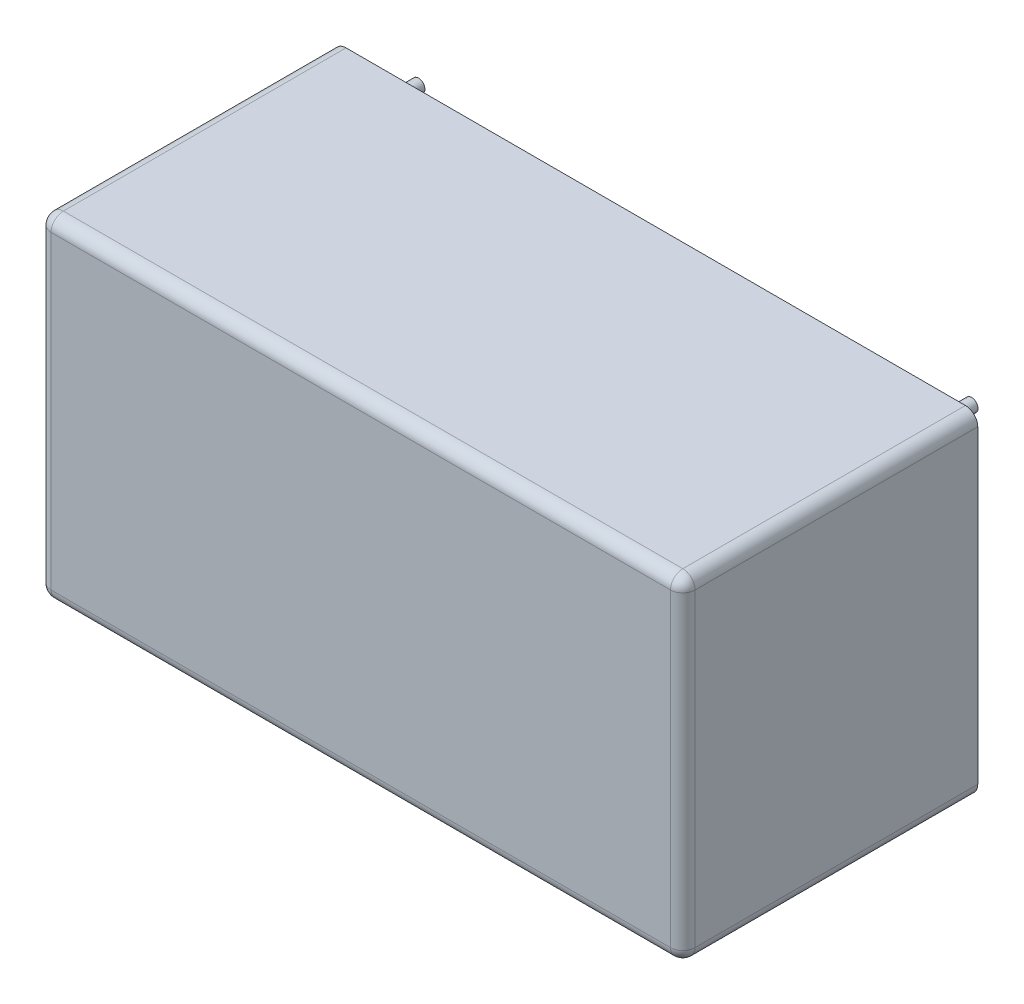
ISO-10303-21;
HEADER;
FILE_DESCRIPTION(('STEP AP214'),'2;1');
FILE_NAME('part.step','',(''),(''),'','','');
FILE_SCHEMA(('AUTOMOTIVE_DESIGN { 1 0 10303 214 1 1 1 1 }'));
ENDSEC;
DATA;
#1=APPLICATION_CONTEXT('core data for automotive mechanical design processes');
#2=APPLICATION_PROTOCOL_DEFINITION('international standard','automotive_design',2000,#1);
#3=PRODUCT_CONTEXT('',#1,'mechanical');
#4=PRODUCT('Part','Part','',(#3));
#5=PRODUCT_RELATED_PRODUCT_CATEGORY('part','',(#4));
#6=PRODUCT_DEFINITION_FORMATION('','',#4);
#7=PRODUCT_DEFINITION_CONTEXT('part definition',#1,'design');
#8=PRODUCT_DEFINITION('design','',#6,#7);
#9=PRODUCT_DEFINITION_SHAPE('','',#8);
#10=(LENGTH_UNIT() NAMED_UNIT(*) SI_UNIT(.MILLI.,.METRE.));
#11=(NAMED_UNIT(*) PLANE_ANGLE_UNIT() SI_UNIT($,.RADIAN.));
#12=(NAMED_UNIT(*) SI_UNIT($,.STERADIAN.) SOLID_ANGLE_UNIT());
#13=UNCERTAINTY_MEASURE_WITH_UNIT(LENGTH_MEASURE(1.E-05),#10,'distance_accuracy_value','');
#14=(GEOMETRIC_REPRESENTATION_CONTEXT(3) GLOBAL_UNCERTAINTY_ASSIGNED_CONTEXT((#13)) GLOBAL_UNIT_ASSIGNED_CONTEXT((#10,
#11,#12)) REPRESENTATION_CONTEXT('',''));
#15=CARTESIAN_POINT('',(0.,0.,0.));
#16=DIRECTION('',(0.,0.,1.));
#17=DIRECTION('',(1.,0.,0.));
#18=AXIS2_PLACEMENT_3D('',#15,#16,#17);
#19=CARTESIAN_POINT('',(-25.2,12.6,24.));
#20=DIRECTION('',(0.,0.,-1.));
#21=DIRECTION('',(-1.,0.,0.));
#22=AXIS2_PLACEMENT_3D('',#19,#20,#21);
#23=CYLINDRICAL_SURFACE('',#22,1.);
#24=DIRECTION('',(0.,0.,-1.));
#25=VECTOR('',#24,1.);
#26=CARTESIAN_POINT('',(-26.2,12.6,24.));
#27=LINE('',#26,#25);
#28=CARTESIAN_POINT('',(-26.2,12.6,23.));
#29=VERTEX_POINT('',#28);
#30=CARTESIAN_POINT('',(-26.2,12.6,0.));
#31=VERTEX_POINT('',#30);
#32=EDGE_CURVE('E109',#29,#31,#27,.T.);
#33=ORIENTED_EDGE('',*,*,#32,.F.);
#34=CARTESIAN_POINT('',(-25.2,12.6,23.));
#35=DIRECTION('',(0.,0.,-1.));
#36=DIRECTION('',(-1.,0.,0.));
#37=AXIS2_PLACEMENT_3D('',#34,#35,#36);
#38=CIRCLE('',#37,1.);
#39=CARTESIAN_POINT('',(-25.2,13.6,23.));
#40=VERTEX_POINT('',#39);
#41=EDGE_CURVE('E11',#29,#40,#38,.T.);
#42=ORIENTED_EDGE('',*,*,#41,.T.);
#43=DIRECTION('',(0.,0.,-1.));
#44=VECTOR('',#43,1.);
#45=CARTESIAN_POINT('',(-25.2,13.6,24.));
#46=LINE('',#45,#44);
#47=CARTESIAN_POINT('',(-25.2,13.6,0.));
#48=VERTEX_POINT('',#47);
#49=EDGE_CURVE('E131',#40,#48,#46,.T.);
#50=ORIENTED_EDGE('',*,*,#49,.T.);
#51=CARTESIAN_POINT('',(-25.2,12.6,0.));
#52=DIRECTION('',(0.,0.,1.));
#53=DIRECTION('',(1.,0.,0.));
#54=AXIS2_PLACEMENT_3D('',#51,#52,#53);
#55=CIRCLE('',#54,1.);
#56=EDGE_CURVE('E124',#48,#31,#55,.T.);
#57=ORIENTED_EDGE('',*,*,#56,.T.);
#58=EDGE_LOOP('',(#33,#42,#50,#57));
#59=FACE_BOUND('',#58,.T.);
#60=ADVANCED_FACE('F33',(#59),#23,.T.);
#61=CARTESIAN_POINT('',(-26.2,12.6,24.));
#62=DIRECTION('',(1.,0.,0.));
#63=DIRECTION('',(0.,1.,0.));
#64=AXIS2_PLACEMENT_3D('',#61,#62,#63);
#65=PLANE('',#64);
#66=DIRECTION('',(0.,0.,-1.));
#67=VECTOR('',#66,1.);
#68=CARTESIAN_POINT('',(-26.2,-12.6,24.));
#69=LINE('',#68,#67);
#70=CARTESIAN_POINT('',(-26.2,-12.6,23.));
#71=VERTEX_POINT('',#70);
#72=CARTESIAN_POINT('',(-26.2,-12.6,0.));
#73=VERTEX_POINT('',#72);
#74=EDGE_CURVE('E118',#71,#73,#69,.T.);
#75=ORIENTED_EDGE('',*,*,#74,.F.);
#76=DIRECTION('',(0.,-1.,0.));
#77=VECTOR('',#76,1.);
#78=CARTESIAN_POINT('',(-26.2,12.6,23.));
#79=LINE('',#78,#77);
#80=EDGE_CURVE('E42',#71,#29,#79,.F.);
#81=ORIENTED_EDGE('',*,*,#80,.T.);
#82=ORIENTED_EDGE('',*,*,#32,.T.);
#83=DIRECTION('',(0.,-1.,0.));
#84=VECTOR('',#83,1.);
#85=CARTESIAN_POINT('',(-26.2,12.6,0.));
#86=LINE('',#85,#84);
#87=EDGE_CURVE('E112',#31,#73,#86,.T.);
#88=ORIENTED_EDGE('',*,*,#87,.T.);
#89=EDGE_LOOP('',(#75,#81,#82,#88));
#90=FACE_BOUND('',#89,.T.);
#91=ADVANCED_FACE('F111',(#90),#65,.F.);
#92=CARTESIAN_POINT('',(-25.2,-12.6,24.));
#93=DIRECTION('',(0.,0.,-1.));
#94=DIRECTION('',(-1.,0.,0.));
#95=AXIS2_PLACEMENT_3D('',#92,#93,#94);
#96=CYLINDRICAL_SURFACE('',#95,1.);
#97=DIRECTION('',(0.,0.,-1.));
#98=VECTOR('',#97,1.);
#99=CARTESIAN_POINT('',(-25.2,-13.6,24.));
#100=LINE('',#99,#98);
#101=CARTESIAN_POINT('',(-25.2,-13.6,23.));
#102=VERTEX_POINT('',#101);
#103=CARTESIAN_POINT('',(-25.2,-13.6,0.));
#104=VERTEX_POINT('',#103);
#105=EDGE_CURVE('E163',#102,#104,#100,.T.);
#106=ORIENTED_EDGE('',*,*,#105,.F.);
#107=CARTESIAN_POINT('',(-25.2,-12.6,23.));
#108=DIRECTION('',(0.,0.,-1.));
#109=DIRECTION('',(-1.,0.,0.));
#110=AXIS2_PLACEMENT_3D('',#107,#108,#109);
#111=CIRCLE('',#110,1.);
#112=EDGE_CURVE('E57',#102,#71,#111,.T.);
#113=ORIENTED_EDGE('',*,*,#112,.T.);
#114=ORIENTED_EDGE('',*,*,#74,.T.);
#115=CARTESIAN_POINT('',(-25.2,-12.6,0.));
#116=DIRECTION('',(0.,0.,1.));
#117=DIRECTION('',(1.,0.,0.));
#118=AXIS2_PLACEMENT_3D('',#115,#116,#117);
#119=CIRCLE('',#118,1.);
#120=EDGE_CURVE('E128',#73,#104,#119,.T.);
#121=ORIENTED_EDGE('',*,*,#120,.T.);
#122=EDGE_LOOP('',(#106,#113,#114,#121));
#123=FACE_BOUND('',#122,.T.);
#124=ADVANCED_FACE('F217',(#123),#96,.T.);
#125=CARTESIAN_POINT('',(-25.2,-13.6,24.));
#126=DIRECTION('',(0.,1.,0.));
#127=DIRECTION('',(0.,0.,1.));
#128=AXIS2_PLACEMENT_3D('',#125,#126,#127);
#129=PLANE('',#128);
#130=DIRECTION('',(0.,0.,-1.));
#131=VECTOR('',#130,1.);
#132=CARTESIAN_POINT('',(25.2,-13.6,24.));
#133=LINE('',#132,#131);
#134=CARTESIAN_POINT('',(25.2,-13.6,23.));
#135=VERTEX_POINT('',#134);
#136=CARTESIAN_POINT('',(25.2,-13.6,0.));
#137=VERTEX_POINT('',#136);
#138=EDGE_CURVE('E161',#135,#137,#133,.T.);
#139=ORIENTED_EDGE('',*,*,#138,.F.);
#140=DIRECTION('',(1.,0.,0.));
#141=VECTOR('',#140,1.);
#142=CARTESIAN_POINT('',(-25.2,-13.6,23.));
#143=LINE('',#142,#141);
#144=EDGE_CURVE('E183',#135,#102,#143,.F.);
#145=ORIENTED_EDGE('',*,*,#144,.T.);
#146=ORIENTED_EDGE('',*,*,#105,.T.);
#147=DIRECTION('',(1.,0.,0.));
#148=VECTOR('',#147,1.);
#149=CARTESIAN_POINT('',(-25.2,-13.6,0.));
#150=LINE('',#149,#148);
#151=EDGE_CURVE('E140',#104,#137,#150,.T.);
#152=ORIENTED_EDGE('',*,*,#151,.T.);
#153=EDGE_LOOP('',(#139,#145,#146,#152));
#154=FACE_BOUND('',#153,.T.);
#155=ADVANCED_FACE('F216',(#154),#129,.F.);
#156=CARTESIAN_POINT('',(25.2,-12.6,24.));
#157=DIRECTION('',(0.,0.,-1.));
#158=DIRECTION('',(-1.,0.,0.));
#159=AXIS2_PLACEMENT_3D('',#156,#157,#158);
#160=CYLINDRICAL_SURFACE('',#159,1.);
#161=DIRECTION('',(0.,0.,-1.));
#162=VECTOR('',#161,1.);
#163=CARTESIAN_POINT('',(26.2,-12.6,24.));
#164=LINE('',#163,#162);
#165=CARTESIAN_POINT('',(26.2,-12.6,23.));
#166=VERTEX_POINT('',#165);
#167=CARTESIAN_POINT('',(26.2,-12.6,0.));
#168=VERTEX_POINT('',#167);
#169=EDGE_CURVE('E159',#166,#168,#164,.T.);
#170=ORIENTED_EDGE('',*,*,#169,.F.);
#171=CARTESIAN_POINT('',(25.2,-12.6,23.));
#172=DIRECTION('',(0.,0.,-1.));
#173=DIRECTION('',(-1.,0.,0.));
#174=AXIS2_PLACEMENT_3D('',#171,#172,#173);
#175=CIRCLE('',#174,1.);
#176=EDGE_CURVE('E181',#166,#135,#175,.T.);
#177=ORIENTED_EDGE('',*,*,#176,.T.);
#178=ORIENTED_EDGE('',*,*,#138,.T.);
#179=CARTESIAN_POINT('',(25.2,-12.6,0.));
#180=DIRECTION('',(0.,0.,1.));
#181=DIRECTION('',(1.,0.,0.));
#182=AXIS2_PLACEMENT_3D('',#179,#180,#181);
#183=CIRCLE('',#182,1.);
#184=EDGE_CURVE('E143',#137,#168,#183,.T.);
#185=ORIENTED_EDGE('',*,*,#184,.T.);
#186=EDGE_LOOP('',(#170,#177,#178,#185));
#187=FACE_BOUND('',#186,.T.);
#188=ADVANCED_FACE('F222',(#187),#160,.T.);
#189=CARTESIAN_POINT('',(26.2,12.6,24.));
#190=DIRECTION('',(1.,0.,0.));
#191=DIRECTION('',(0.,1.,0.));
#192=AXIS2_PLACEMENT_3D('',#189,#190,#191);
#193=PLANE('',#192);
#194=DIRECTION('',(0.,0.,-1.));
#195=VECTOR('',#194,1.);
#196=CARTESIAN_POINT('',(26.2,12.6,24.));
#197=LINE('',#196,#195);
#198=CARTESIAN_POINT('',(26.2,12.6,23.));
#199=VERTEX_POINT('',#198);
#200=CARTESIAN_POINT('',(26.2,12.6,0.));
#201=VERTEX_POINT('',#200);
#202=EDGE_CURVE('E157',#199,#201,#197,.T.);
#203=ORIENTED_EDGE('',*,*,#202,.F.);
#204=DIRECTION('',(0.,-1.,0.));
#205=VECTOR('',#204,1.);
#206=CARTESIAN_POINT('',(26.2,12.6,23.));
#207=LINE('',#206,#205);
#208=EDGE_CURVE('E179',#199,#166,#207,.T.);
#209=ORIENTED_EDGE('',*,*,#208,.T.);
#210=ORIENTED_EDGE('',*,*,#169,.T.);
#211=DIRECTION('',(0.,-1.,0.));
#212=VECTOR('',#211,1.);
#213=CARTESIAN_POINT('',(26.2,12.6,0.));
#214=LINE('',#213,#212);
#215=EDGE_CURVE('E146',#201,#168,#214,.T.);
#216=ORIENTED_EDGE('',*,*,#215,.F.);
#217=EDGE_LOOP('',(#203,#209,#210,#216));
#218=FACE_BOUND('',#217,.T.);
#219=ADVANCED_FACE('F225',(#218),#193,.T.);
#220=CARTESIAN_POINT('',(25.2,12.6,24.));
#221=DIRECTION('',(0.,0.,-1.));
#222=DIRECTION('',(-1.,0.,0.));
#223=AXIS2_PLACEMENT_3D('',#220,#221,#222);
#224=CYLINDRICAL_SURFACE('',#223,1.);
#225=DIRECTION('',(0.,0.,-1.));
#226=VECTOR('',#225,1.);
#227=CARTESIAN_POINT('',(25.2,13.6,24.));
#228=LINE('',#227,#226);
#229=CARTESIAN_POINT('',(25.2,13.6,23.));
#230=VERTEX_POINT('',#229);
#231=CARTESIAN_POINT('',(25.2,13.6,0.));
#232=VERTEX_POINT('',#231);
#233=EDGE_CURVE('E155',#230,#232,#228,.T.);
#234=ORIENTED_EDGE('',*,*,#233,.F.);
#235=CARTESIAN_POINT('',(25.2,12.6,23.));
#236=DIRECTION('',(0.,0.,-1.));
#237=DIRECTION('',(-1.,0.,0.));
#238=AXIS2_PLACEMENT_3D('',#235,#236,#237);
#239=CIRCLE('',#238,1.);
#240=EDGE_CURVE('E177',#230,#199,#239,.T.);
#241=ORIENTED_EDGE('',*,*,#240,.T.);
#242=ORIENTED_EDGE('',*,*,#202,.T.);
#243=CARTESIAN_POINT('',(25.2,12.6,0.));
#244=DIRECTION('',(0.,0.,-1.));
#245=DIRECTION('',(-1.,0.,0.));
#246=AXIS2_PLACEMENT_3D('',#243,#244,#245);
#247=CIRCLE('',#246,1.);
#248=EDGE_CURVE('E149',#232,#201,#247,.T.);
#249=ORIENTED_EDGE('',*,*,#248,.F.);
#250=EDGE_LOOP('',(#234,#241,#242,#249));
#251=FACE_BOUND('',#250,.T.);
#252=ADVANCED_FACE('F420',(#251),#224,.T.);
#253=CARTESIAN_POINT('',(-25.2,13.6,24.));
#254=DIRECTION('',(0.,1.,0.));
#255=DIRECTION('',(0.,0.,1.));
#256=AXIS2_PLACEMENT_3D('',#253,#254,#255);
#257=PLANE('',#256);
#258=ORIENTED_EDGE('',*,*,#49,.F.);
#259=DIRECTION('',(1.,0.,0.));
#260=VECTOR('',#259,1.);
#261=CARTESIAN_POINT('',(-25.2,13.6,23.));
#262=LINE('',#261,#260);
#263=EDGE_CURVE('E117',#40,#230,#262,.T.);
#264=ORIENTED_EDGE('',*,*,#263,.T.);
#265=ORIENTED_EDGE('',*,*,#233,.T.);
#266=DIRECTION('',(1.,0.,0.));
#267=VECTOR('',#266,1.);
#268=CARTESIAN_POINT('',(-25.2,13.6,0.));
#269=LINE('',#268,#267);
#270=EDGE_CURVE('E152',#48,#232,#269,.T.);
#271=ORIENTED_EDGE('',*,*,#270,.F.);
#272=EDGE_LOOP('',(#258,#264,#265,#271));
#273=FACE_BOUND('',#272,.T.);
#274=ADVANCED_FACE('F412',(#273),#257,.T.);
#275=CARTESIAN_POINT('',(-25.2,12.6,24.));
#276=DIRECTION('',(0.,0.,1.));
#277=DIRECTION('',(1.,0.,0.));
#278=AXIS2_PLACEMENT_3D('',#275,#276,#277);
#279=PLANE('',#278);
#280=DIRECTION('',(0.,-1.,0.));
#281=VECTOR('',#280,1.);
#282=CARTESIAN_POINT('',(25.2,12.6,24.));
#283=LINE('',#282,#281);
#284=CARTESIAN_POINT('',(25.2,-12.6,24.));
#285=VERTEX_POINT('',#284);
#286=CARTESIAN_POINT('',(25.2,12.6,24.));
#287=VERTEX_POINT('',#286);
#288=EDGE_CURVE('E172',#285,#287,#283,.F.);
#289=ORIENTED_EDGE('',*,*,#288,.T.);
#290=DIRECTION('',(1.,0.,0.));
#291=VECTOR('',#290,1.);
#292=CARTESIAN_POINT('',(-25.2,12.6,24.));
#293=LINE('',#292,#291);
#294=CARTESIAN_POINT('',(-25.2,12.6,24.));
#295=VERTEX_POINT('',#294);
#296=EDGE_CURVE('E174',#287,#295,#293,.F.);
#297=ORIENTED_EDGE('',*,*,#296,.T.);
#298=DIRECTION('',(0.,-1.,0.));
#299=VECTOR('',#298,1.);
#300=CARTESIAN_POINT('',(-25.2,-12.6,24.));
#301=LINE('',#300,#299);
#302=CARTESIAN_POINT('',(-25.2,-12.6,24.));
#303=VERTEX_POINT('',#302);
#304=EDGE_CURVE('E168',#295,#303,#301,.T.);
#305=ORIENTED_EDGE('',*,*,#304,.T.);
#306=DIRECTION('',(1.,0.,0.));
#307=VECTOR('',#306,1.);
#308=CARTESIAN_POINT('',(25.2,-12.6,24.));
#309=LINE('',#308,#307);
#310=EDGE_CURVE('E170',#303,#285,#309,.T.);
#311=ORIENTED_EDGE('',*,*,#310,.T.);
#312=EDGE_LOOP('',(#289,#297,#305,#311));
#313=FACE_BOUND('',#312,.T.);
#314=ADVANCED_FACE('F240',(#313),#279,.T.);
#315=CARTESIAN_POINT('',(-25.2,12.6,0.));
#316=DIRECTION('',(0.,0.,1.));
#317=DIRECTION('',(1.,0.,0.));
#318=AXIS2_PLACEMENT_3D('',#315,#316,#317);
#319=PLANE('',#318);
#320=CARTESIAN_POINT('',(-22.8,-10.4,0.));
#321=DIRECTION('',(0.,0.,1.));
#322=DIRECTION('',(1.,0.,0.));
#323=AXIS2_PLACEMENT_3D('',#320,#321,#322);
#324=CIRCLE('',#323,0.519999999999999);
#325=CARTESIAN_POINT('',(-22.28,-10.4,0.));
#326=VERTEX_POINT('',#325);
#327=EDGE_CURVE('E482',#326,#326,#324,.T.);
#328=ORIENTED_EDGE('',*,*,#327,.T.);
#329=EDGE_LOOP('',(#328));
#330=FACE_BOUND('',#329,.T.);
#331=CARTESIAN_POINT('',(-22.8,10.4,0.));
#332=DIRECTION('',(0.,0.,1.));
#333=DIRECTION('',(1.,0.,0.));
#334=AXIS2_PLACEMENT_3D('',#331,#332,#333);
#335=CIRCLE('',#334,0.519999999999999);
#336=CARTESIAN_POINT('',(-22.28,10.4,0.));
#337=VERTEX_POINT('',#336);
#338=EDGE_CURVE('E486',#337,#337,#335,.T.);
#339=ORIENTED_EDGE('',*,*,#338,.T.);
#340=EDGE_LOOP('',(#339));
#341=FACE_BOUND('',#340,.T.);
#342=CARTESIAN_POINT('',(22.2,2.4,0.));
#343=DIRECTION('',(0.,0.,1.));
#344=DIRECTION('',(1.,0.,0.));
#345=AXIS2_PLACEMENT_3D('',#342,#343,#344);
#346=CIRCLE('',#345,0.519999999999999);
#347=CARTESIAN_POINT('',(22.72,2.4,0.));
#348=VERTEX_POINT('',#347);
#349=EDGE_CURVE('E490',#348,#348,#346,.T.);
#350=ORIENTED_EDGE('',*,*,#349,.T.);
#351=EDGE_LOOP('',(#350));
#352=FACE_BOUND('',#351,.T.);
#353=CARTESIAN_POINT('',(22.2,10.4,0.));
#354=DIRECTION('',(0.,0.,1.));
#355=DIRECTION('',(1.,0.,0.));
#356=AXIS2_PLACEMENT_3D('',#353,#354,#355);
#357=CIRCLE('',#356,0.519999999999999);
#358=CARTESIAN_POINT('',(22.72,10.4,0.));
#359=VERTEX_POINT('',#358);
#360=EDGE_CURVE('E136',#359,#359,#357,.T.);
#361=ORIENTED_EDGE('',*,*,#360,.T.);
#362=EDGE_LOOP('',(#361));
#363=FACE_BOUND('',#362,.T.);
#364=ORIENTED_EDGE('',*,*,#56,.F.);
#365=ORIENTED_EDGE('',*,*,#270,.T.);
#366=ORIENTED_EDGE('',*,*,#248,.T.);
#367=ORIENTED_EDGE('',*,*,#215,.T.);
#368=ORIENTED_EDGE('',*,*,#184,.F.);
#369=ORIENTED_EDGE('',*,*,#151,.F.);
#370=ORIENTED_EDGE('',*,*,#120,.F.);
#371=ORIENTED_EDGE('',*,*,#87,.F.);
#372=EDGE_LOOP('',(#364,#365,#366,#367,#368,#369,#370,#371));
#373=FACE_BOUND('',#372,.T.);
#374=ADVANCED_FACE('F122',(#330,#341,#352,#363,#373),#319,.F.);
#375=CARTESIAN_POINT('',(-25.2,-12.6,23.));
#376=DIRECTION('',(-1.,0.,0.));
#377=DIRECTION('',(0.,0.,1.));
#378=AXIS2_PLACEMENT_3D('',#375,#376,#377);
#379=CYLINDRICAL_SURFACE('',#378,1.);
#380=CARTESIAN_POINT('',(-25.2,-12.6,23.));
#381=DIRECTION('',(-1.,0.,0.));
#382=DIRECTION('',(0.,0.,1.));
#383=AXIS2_PLACEMENT_3D('',#380,#381,#382);
#384=CIRCLE('',#383,1.);
#385=EDGE_CURVE('E37',#102,#303,#384,.T.);
#386=ORIENTED_EDGE('',*,*,#385,.F.);
#387=ORIENTED_EDGE('',*,*,#144,.F.);
#388=CARTESIAN_POINT('',(25.2,-12.6,23.));
#389=DIRECTION('',(1.,0.,0.));
#390=DIRECTION('',(0.,1.,0.));
#391=AXIS2_PLACEMENT_3D('',#388,#389,#390);
#392=CIRCLE('',#391,1.);
#393=EDGE_CURVE('E134',#285,#135,#392,.T.);
#394=ORIENTED_EDGE('',*,*,#393,.F.);
#395=ORIENTED_EDGE('',*,*,#310,.F.);
#396=EDGE_LOOP('',(#386,#387,#394,#395));
#397=FACE_BOUND('',#396,.T.);
#398=ADVANCED_FACE('F35',(#397),#379,.T.);
#399=CARTESIAN_POINT('',(-25.2,-12.6,23.));
#400=DIRECTION('',(0.,0.,1.));
#401=DIRECTION('',(1.,0.,0.));
#402=AXIS2_PLACEMENT_3D('',#399,#400,#401);
#403=SPHERICAL_SURFACE('',#402,1.);
#404=ORIENTED_EDGE('',*,*,#112,.F.);
#405=ORIENTED_EDGE('',*,*,#385,.T.);
#406=CARTESIAN_POINT('',(-25.2,-12.6,23.));
#407=DIRECTION('',(0.,1.,0.));
#408=DIRECTION('',(-1.,0.,0.));
#409=AXIS2_PLACEMENT_3D('',#406,#407,#408);
#410=CIRCLE('',#409,1.);
#411=EDGE_CURVE('E201',#71,#303,#410,.T.);
#412=ORIENTED_EDGE('',*,*,#411,.F.);
#413=EDGE_LOOP('',(#404,#405,#412));
#414=FACE_BOUND('',#413,.T.);
#415=ADVANCED_FACE('F247',(#414),#403,.T.);
#416=CARTESIAN_POINT('',(25.2,-12.6,23.));
#417=DIRECTION('',(0.,0.,1.));
#418=DIRECTION('',(1.,0.,0.));
#419=AXIS2_PLACEMENT_3D('',#416,#417,#418);
#420=SPHERICAL_SURFACE('',#419,1.);
#421=ORIENTED_EDGE('',*,*,#393,.T.);
#422=ORIENTED_EDGE('',*,*,#176,.F.);
#423=CARTESIAN_POINT('',(25.2,-12.6,23.));
#424=DIRECTION('',(0.,1.,0.));
#425=DIRECTION('',(-1.,0.,0.));
#426=AXIS2_PLACEMENT_3D('',#423,#424,#425);
#427=CIRCLE('',#426,1.);
#428=EDGE_CURVE('E198',#285,#166,#427,.T.);
#429=ORIENTED_EDGE('',*,*,#428,.F.);
#430=EDGE_LOOP('',(#421,#422,#429));
#431=FACE_BOUND('',#430,.T.);
#432=ADVANCED_FACE('F208',(#431),#420,.T.);
#433=CARTESIAN_POINT('',(-25.2,12.6,23.));
#434=DIRECTION('',(0.,1.,0.));
#435=DIRECTION('',(-1.,0.,0.));
#436=AXIS2_PLACEMENT_3D('',#433,#434,#435);
#437=CYLINDRICAL_SURFACE('',#436,1.);
#438=ORIENTED_EDGE('',*,*,#411,.T.);
#439=ORIENTED_EDGE('',*,*,#304,.F.);
#440=CARTESIAN_POINT('',(-25.2,12.6,23.));
#441=DIRECTION('',(0.,1.,0.));
#442=DIRECTION('',(0.,0.,1.));
#443=AXIS2_PLACEMENT_3D('',#440,#441,#442);
#444=CIRCLE('',#443,1.);
#445=EDGE_CURVE('E195',#29,#295,#444,.T.);
#446=ORIENTED_EDGE('',*,*,#445,.F.);
#447=ORIENTED_EDGE('',*,*,#80,.F.);
#448=EDGE_LOOP('',(#438,#439,#446,#447));
#449=FACE_BOUND('',#448,.T.);
#450=ADVANCED_FACE('F243',(#449),#437,.T.);
#451=CARTESIAN_POINT('',(25.2,12.6,23.));
#452=DIRECTION('',(0.,-1.,0.));
#453=DIRECTION('',(1.,0.,0.));
#454=AXIS2_PLACEMENT_3D('',#451,#452,#453);
#455=CYLINDRICAL_SURFACE('',#454,1.);
#456=ORIENTED_EDGE('',*,*,#428,.T.);
#457=ORIENTED_EDGE('',*,*,#208,.F.);
#458=CARTESIAN_POINT('',(25.2,12.6,23.));
#459=DIRECTION('',(0.,1.,0.));
#460=DIRECTION('',(-1.,0.,0.));
#461=AXIS2_PLACEMENT_3D('',#458,#459,#460);
#462=CIRCLE('',#461,1.);
#463=EDGE_CURVE('E192',#287,#199,#462,.T.);
#464=ORIENTED_EDGE('',*,*,#463,.F.);
#465=ORIENTED_EDGE('',*,*,#288,.F.);
#466=EDGE_LOOP('',(#456,#457,#464,#465));
#467=FACE_BOUND('',#466,.T.);
#468=ADVANCED_FACE('F229',(#467),#455,.T.);
#469=CARTESIAN_POINT('',(-25.2,12.6,23.));
#470=DIRECTION('',(0.,0.,1.));
#471=DIRECTION('',(1.,0.,0.));
#472=AXIS2_PLACEMENT_3D('',#469,#470,#471);
#473=SPHERICAL_SURFACE('',#472,1.);
#474=ORIENTED_EDGE('',*,*,#41,.F.);
#475=ORIENTED_EDGE('',*,*,#445,.T.);
#476=CARTESIAN_POINT('',(-25.2,12.6,23.));
#477=DIRECTION('',(1.,0.,0.));
#478=DIRECTION('',(0.,1.,0.));
#479=AXIS2_PLACEMENT_3D('',#476,#477,#478);
#480=CIRCLE('',#479,1.);
#481=EDGE_CURVE('E189',#40,#295,#480,.T.);
#482=ORIENTED_EDGE('',*,*,#481,.F.);
#483=EDGE_LOOP('',(#474,#475,#482));
#484=FACE_BOUND('',#483,.T.);
#485=ADVANCED_FACE('F267',(#484),#473,.T.);
#486=CARTESIAN_POINT('',(25.2,12.6,23.));
#487=DIRECTION('',(0.,0.,1.));
#488=DIRECTION('',(1.,0.,0.));
#489=AXIS2_PLACEMENT_3D('',#486,#487,#488);
#490=SPHERICAL_SURFACE('',#489,1.);
#491=ORIENTED_EDGE('',*,*,#463,.T.);
#492=ORIENTED_EDGE('',*,*,#240,.F.);
#493=CARTESIAN_POINT('',(25.2,12.6,23.));
#494=DIRECTION('',(-1.,0.,0.));
#495=DIRECTION('',(0.,-1.,0.));
#496=AXIS2_PLACEMENT_3D('',#493,#494,#495);
#497=CIRCLE('',#496,1.);
#498=EDGE_CURVE('E187',#287,#230,#497,.T.);
#499=ORIENTED_EDGE('',*,*,#498,.F.);
#500=EDGE_LOOP('',(#491,#492,#499));
#501=FACE_BOUND('',#500,.T.);
#502=ADVANCED_FACE('F234',(#501),#490,.T.);
#503=CARTESIAN_POINT('',(-25.2,12.6,23.));
#504=DIRECTION('',(1.,0.,0.));
#505=DIRECTION('',(0.,0.,-1.));
#506=AXIS2_PLACEMENT_3D('',#503,#504,#505);
#507=CYLINDRICAL_SURFACE('',#506,1.);
#508=ORIENTED_EDGE('',*,*,#481,.T.);
#509=ORIENTED_EDGE('',*,*,#296,.F.);
#510=ORIENTED_EDGE('',*,*,#498,.T.);
#511=ORIENTED_EDGE('',*,*,#263,.F.);
#512=EDGE_LOOP('',(#508,#509,#510,#511));
#513=FACE_BOUND('',#512,.T.);
#514=ADVANCED_FACE('F237',(#513),#507,.T.);
#515=CARTESIAN_POINT('',(22.2,10.4,-3.5));
#516=DIRECTION('',(0.,0.,1.));
#517=DIRECTION('',(1.,0.,0.));
#518=AXIS2_PLACEMENT_3D('',#515,#516,#517);
#519=CYLINDRICAL_SURFACE('',#518,0.519999999999999);
#520=CARTESIAN_POINT('',(22.2,10.4,-3.5));
#521=DIRECTION('',(0.,0.,1.));
#522=DIRECTION('',(1.,0.,0.));
#523=AXIS2_PLACEMENT_3D('',#520,#521,#522);
#524=CIRCLE('',#523,0.519999999999999);
#525=CARTESIAN_POINT('',(22.72,10.4,-3.5));
#526=VERTEX_POINT('',#525);
#527=EDGE_CURVE('E190',#526,#526,#524,.T.);
#528=ORIENTED_EDGE('',*,*,#527,.T.);
#529=EDGE_LOOP('',(#528));
#530=FACE_BOUND('',#529,.T.);
#531=ORIENTED_EDGE('',*,*,#360,.F.);
#532=EDGE_LOOP('',(#531));
#533=FACE_BOUND('',#532,.T.);
#534=ADVANCED_FACE('F264',(#530,#533),#519,.T.);
#535=CARTESIAN_POINT('',(22.2,10.4,-3.5));
#536=DIRECTION('',(0.,0.,1.));
#537=DIRECTION('',(1.,0.,0.));
#538=AXIS2_PLACEMENT_3D('',#535,#536,#537);
#539=PLANE('',#538);
#540=ORIENTED_EDGE('',*,*,#527,.F.);
#541=EDGE_LOOP('',(#540));
#542=FACE_BOUND('',#541,.T.);
#543=ADVANCED_FACE('F301',(#542),#539,.F.);
#544=CARTESIAN_POINT('',(22.2,2.4,-3.5));
#545=DIRECTION('',(0.,0.,1.));
#546=DIRECTION('',(1.,0.,0.));
#547=AXIS2_PLACEMENT_3D('',#544,#545,#546);
#548=CYLINDRICAL_SURFACE('',#547,0.519999999999999);
#549=CARTESIAN_POINT('',(22.2,2.4,-3.5));
#550=DIRECTION('',(0.,0.,1.));
#551=DIRECTION('',(1.,0.,0.));
#552=AXIS2_PLACEMENT_3D('',#549,#550,#551);
#553=CIRCLE('',#552,0.519999999999999);
#554=CARTESIAN_POINT('',(22.72,2.4,-3.5));
#555=VERTEX_POINT('',#554);
#556=EDGE_CURVE('E495',#555,#555,#553,.T.);
#557=ORIENTED_EDGE('',*,*,#556,.T.);
#558=EDGE_LOOP('',(#557));
#559=FACE_BOUND('',#558,.T.);
#560=ORIENTED_EDGE('',*,*,#349,.F.);
#561=EDGE_LOOP('',(#560));
#562=FACE_BOUND('',#561,.T.);
#563=ADVANCED_FACE('F309',(#559,#562),#548,.T.);
#564=CARTESIAN_POINT('',(22.2,2.4,-3.5));
#565=DIRECTION('',(0.,0.,1.));
#566=DIRECTION('',(1.,0.,0.));
#567=AXIS2_PLACEMENT_3D('',#564,#565,#566);
#568=PLANE('',#567);
#569=ORIENTED_EDGE('',*,*,#556,.F.);
#570=EDGE_LOOP('',(#569));
#571=FACE_BOUND('',#570,.T.);
#572=ADVANCED_FACE('F317',(#571),#568,.F.);
#573=CARTESIAN_POINT('',(-22.8,10.4,-3.5));
#574=DIRECTION('',(0.,0.,1.));
#575=DIRECTION('',(1.,0.,0.));
#576=AXIS2_PLACEMENT_3D('',#573,#574,#575);
#577=CYLINDRICAL_SURFACE('',#576,0.519999999999999);
#578=CARTESIAN_POINT('',(-22.8,10.4,-3.5));
#579=DIRECTION('',(0.,0.,1.));
#580=DIRECTION('',(1.,0.,0.));
#581=AXIS2_PLACEMENT_3D('',#578,#579,#580);
#582=CIRCLE('',#581,0.519999999999999);
#583=CARTESIAN_POINT('',(-22.28,10.4,-3.5));
#584=VERTEX_POINT('',#583);
#585=EDGE_CURVE('E500',#584,#584,#582,.T.);
#586=ORIENTED_EDGE('',*,*,#585,.T.);
#587=EDGE_LOOP('',(#586));
#588=FACE_BOUND('',#587,.T.);
#589=ORIENTED_EDGE('',*,*,#338,.F.);
#590=EDGE_LOOP('',(#589));
#591=FACE_BOUND('',#590,.T.);
#592=ADVANCED_FACE('F325',(#588,#591),#577,.T.);
#593=CARTESIAN_POINT('',(-22.8,10.4,-3.5));
#594=DIRECTION('',(0.,0.,1.));
#595=DIRECTION('',(1.,0.,0.));
#596=AXIS2_PLACEMENT_3D('',#593,#594,#595);
#597=PLANE('',#596);
#598=ORIENTED_EDGE('',*,*,#585,.F.);
#599=EDGE_LOOP('',(#598));
#600=FACE_BOUND('',#599,.T.);
#601=ADVANCED_FACE('F333',(#600),#597,.F.);
#602=CARTESIAN_POINT('',(-22.8,-10.4,-3.5));
#603=DIRECTION('',(0.,0.,1.));
#604=DIRECTION('',(1.,0.,0.));
#605=AXIS2_PLACEMENT_3D('',#602,#603,#604);
#606=CYLINDRICAL_SURFACE('',#605,0.519999999999999);
#607=CARTESIAN_POINT('',(-22.8,-10.4,-3.5));
#608=DIRECTION('',(0.,0.,1.));
#609=DIRECTION('',(1.,0.,0.));
#610=AXIS2_PLACEMENT_3D('',#607,#608,#609);
#611=CIRCLE('',#610,0.519999999999999);
#612=CARTESIAN_POINT('',(-22.28,-10.4,-3.5));
#613=VERTEX_POINT('',#612);
#614=EDGE_CURVE('E504',#613,#613,#611,.T.);
#615=ORIENTED_EDGE('',*,*,#614,.T.);
#616=EDGE_LOOP('',(#615));
#617=FACE_BOUND('',#616,.T.);
#618=ORIENTED_EDGE('',*,*,#327,.F.);
#619=EDGE_LOOP('',(#618));
#620=FACE_BOUND('',#619,.T.);
#621=ADVANCED_FACE('F341',(#617,#620),#606,.T.);
#622=CARTESIAN_POINT('',(-22.8,-10.4,-3.5));
#623=DIRECTION('',(0.,0.,1.));
#624=DIRECTION('',(1.,0.,0.));
#625=AXIS2_PLACEMENT_3D('',#622,#623,#624);
#626=PLANE('',#625);
#627=ORIENTED_EDGE('',*,*,#614,.F.);
#628=EDGE_LOOP('',(#627));
#629=FACE_BOUND('',#628,.T.);
#630=ADVANCED_FACE('F349',(#629),#626,.F.);
#631=CLOSED_SHELL('',(#60,#91,#124,#155,#188,#219,#252,#274,#314,#374,#398,#415,#432,#450,#468,
#485,#502,#514,#534,#543,#563,#572,#592,#601,#621,#630));
#632=MANIFOLD_SOLID_BREP('B2',#631);
#633=ADVANCED_BREP_SHAPE_REPRESENTATION('',(#18,#632),#14);
#634=SHAPE_DEFINITION_REPRESENTATION(#9,#633);
ENDSEC;
END-ISO-10303-21;
